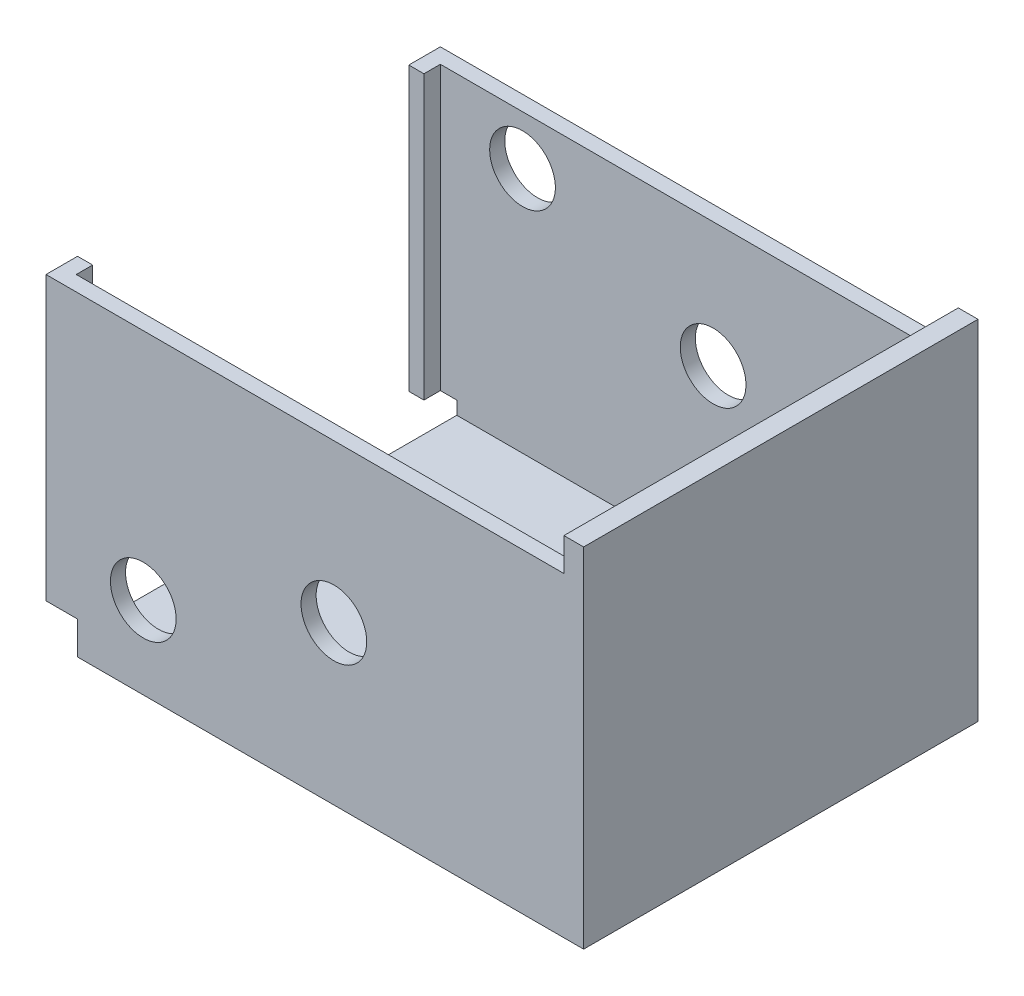
ISO-10303-21;
HEADER;
FILE_DESCRIPTION(('STEP AP214'),'2;1');
FILE_NAME('part.step','',(''),(''),'','','');
FILE_SCHEMA(('AUTOMOTIVE_DESIGN { 1 0 10303 214 1 1 1 1 }'));
ENDSEC;
DATA;
#1=APPLICATION_CONTEXT('core data for automotive mechanical design processes');
#2=APPLICATION_PROTOCOL_DEFINITION('international standard','automotive_design',2000,#1);
#3=PRODUCT_CONTEXT('',#1,'mechanical');
#4=PRODUCT('Part','Part','',(#3));
#5=PRODUCT_RELATED_PRODUCT_CATEGORY('part','',(#4));
#6=PRODUCT_DEFINITION_FORMATION('','',#4);
#7=PRODUCT_DEFINITION_CONTEXT('part definition',#1,'design');
#8=PRODUCT_DEFINITION('design','',#6,#7);
#9=PRODUCT_DEFINITION_SHAPE('','',#8);
#10=(LENGTH_UNIT() NAMED_UNIT(*) SI_UNIT(.MILLI.,.METRE.));
#11=(NAMED_UNIT(*) PLANE_ANGLE_UNIT() SI_UNIT($,.RADIAN.));
#12=(NAMED_UNIT(*) SI_UNIT($,.STERADIAN.) SOLID_ANGLE_UNIT());
#13=UNCERTAINTY_MEASURE_WITH_UNIT(LENGTH_MEASURE(1.E-05),#10,'distance_accuracy_value','');
#14=(GEOMETRIC_REPRESENTATION_CONTEXT(3) GLOBAL_UNCERTAINTY_ASSIGNED_CONTEXT((#13)) GLOBAL_UNIT_ASSIGNED_CONTEXT((#10,
#11,#12)) REPRESENTATION_CONTEXT('',''));
#15=CARTESIAN_POINT('',(0.,0.,0.));
#16=DIRECTION('',(0.,0.,1.));
#17=DIRECTION('',(1.,0.,0.));
#18=AXIS2_PLACEMENT_3D('',#15,#16,#17);
#19=CARTESIAN_POINT('',(74.,53.,-57.7));
#20=DIRECTION('',(0.,0.,-1.));
#21=DIRECTION('',(-1.,0.,0.));
#22=AXIS2_PLACEMENT_3D('',#19,#20,#21);
#23=PLANE('',#22);
#24=CARTESIAN_POINT('',(9.99999999999999,40.5,-57.7));
#25=DIRECTION('',(0.,0.,-1.));
#26=DIRECTION('',(-1.,0.,0.));
#27=AXIS2_PLACEMENT_3D('',#24,#25,#26);
#28=CIRCLE('',#27,5.);
#29=CARTESIAN_POINT('',(4.99999999999999,40.5,-57.7));
#30=VERTEX_POINT('',#29);
#31=EDGE_CURVE('E290',#30,#30,#28,.F.);
#32=ORIENTED_EDGE('',*,*,#31,.F.);
#33=EDGE_LOOP('',(#32));
#34=FACE_BOUND('',#33,.T.);
#35=CARTESIAN_POINT('',(39.,29.,-57.7));
#36=DIRECTION('',(0.,0.,-1.));
#37=DIRECTION('',(-1.,0.,0.));
#38=AXIS2_PLACEMENT_3D('',#35,#36,#37);
#39=CIRCLE('',#38,5.);
#40=CARTESIAN_POINT('',(34.,29.,-57.7));
#41=VERTEX_POINT('',#40);
#42=EDGE_CURVE('E283',#41,#41,#39,.F.);
#43=ORIENTED_EDGE('',*,*,#42,.F.);
#44=EDGE_LOOP('',(#43));
#45=FACE_BOUND('',#44,.T.);
#46=DIRECTION('',(0.,-1.,0.));
#47=VECTOR('',#46,1.);
#48=CARTESIAN_POINT('',(74.,53.,-57.7));
#49=LINE('',#48,#47);
#50=CARTESIAN_POINT('',(74.,48.,-57.7));
#51=VERTEX_POINT('',#50);
#52=CARTESIAN_POINT('',(74.,3.,-57.7));
#53=VERTEX_POINT('',#52);
#54=EDGE_CURVE('E310',#51,#53,#49,.T.);
#55=ORIENTED_EDGE('',*,*,#54,.F.);
#56=DIRECTION('',(1.,0.,0.));
#57=VECTOR('',#56,1.);
#58=CARTESIAN_POINT('',(-2.49999999999999,48.,-57.7));
#59=LINE('',#58,#57);
#60=CARTESIAN_POINT('',(-2.49999999999999,48.,-57.7));
#61=VERTEX_POINT('',#60);
#62=EDGE_CURVE('E252',#61,#51,#59,.T.);
#63=ORIENTED_EDGE('',*,*,#62,.F.);
#64=DIRECTION('',(0.,-1.,0.));
#65=VECTOR('',#64,1.);
#66=CARTESIAN_POINT('',(-2.49999999999999,59.7882250993909,-57.7));
#67=LINE('',#66,#65);
#68=CARTESIAN_POINT('',(-2.49999999999999,5.,-57.7));
#69=VERTEX_POINT('',#68);
#70=EDGE_CURVE('E227',#61,#69,#67,.T.);
#71=ORIENTED_EDGE('',*,*,#70,.T.);
#72=DIRECTION('',(-1.,0.,0.));
#73=VECTOR('',#72,1.);
#74=CARTESIAN_POINT('',(0.,5.,-57.7));
#75=LINE('',#74,#73);
#76=CARTESIAN_POINT('',(0.,5.,-57.7));
#77=VERTEX_POINT('',#76);
#78=EDGE_CURVE('E61',#77,#69,#75,.T.);
#79=ORIENTED_EDGE('',*,*,#78,.F.);
#80=DIRECTION('',(0.,-1.,0.));
#81=VECTOR('',#80,1.);
#82=CARTESIAN_POINT('',(0.,5.,-57.7));
#83=LINE('',#82,#81);
#84=CARTESIAN_POINT('',(0.,3.,-57.7));
#85=VERTEX_POINT('',#84);
#86=EDGE_CURVE('E213',#77,#85,#83,.T.);
#87=ORIENTED_EDGE('',*,*,#86,.T.);
#88=DIRECTION('',(1.,0.,0.));
#89=VECTOR('',#88,1.);
#90=CARTESIAN_POINT('',(74.,3.,-57.7));
#91=LINE('',#90,#89);
#92=EDGE_CURVE('E286',#85,#53,#91,.T.);
#93=ORIENTED_EDGE('',*,*,#92,.T.);
#94=EDGE_LOOP('',(#55,#63,#71,#79,#87,#93));
#95=FACE_BOUND('',#94,.T.);
#96=ADVANCED_FACE('F38',(#34,#45,#95),#23,.F.);
#97=CARTESIAN_POINT('',(0.,53.,-2.3));
#98=DIRECTION('',(0.,0.,1.));
#99=DIRECTION('',(1.,0.,0.));
#100=AXIS2_PLACEMENT_3D('',#97,#98,#99);
#101=PLANE('',#100);
#102=CARTESIAN_POINT('',(39.,24.,-2.3));
#103=DIRECTION('',(0.,0.,1.));
#104=DIRECTION('',(1.,0.,0.));
#105=AXIS2_PLACEMENT_3D('',#102,#103,#104);
#106=CIRCLE('',#105,5.);
#107=CARTESIAN_POINT('',(44.,24.,-2.3));
#108=VERTEX_POINT('',#107);
#109=EDGE_CURVE('E202',#108,#108,#106,.T.);
#110=ORIENTED_EDGE('',*,*,#109,.T.);
#111=EDGE_LOOP('',(#110));
#112=FACE_BOUND('',#111,.T.);
#113=CARTESIAN_POINT('',(9.99999999999999,12.5,-2.3));
#114=DIRECTION('',(0.,0.,1.));
#115=DIRECTION('',(1.,0.,0.));
#116=AXIS2_PLACEMENT_3D('',#113,#114,#115);
#117=CIRCLE('',#116,5.);
#118=CARTESIAN_POINT('',(15.,12.5,-2.3));
#119=VERTEX_POINT('',#118);
#120=EDGE_CURVE('E207',#119,#119,#117,.T.);
#121=ORIENTED_EDGE('',*,*,#120,.T.);
#122=EDGE_LOOP('',(#121));
#123=FACE_BOUND('',#122,.T.);
#124=DIRECTION('',(-1.,0.,0.));
#125=VECTOR('',#124,1.);
#126=CARTESIAN_POINT('',(-2.5,48.,-2.3));
#127=LINE('',#126,#125);
#128=CARTESIAN_POINT('',(74.,48.,-2.3));
#129=VERTEX_POINT('',#128);
#130=CARTESIAN_POINT('',(-2.5,48.,-2.3));
#131=VERTEX_POINT('',#130);
#132=EDGE_CURVE('E177',#129,#131,#127,.T.);
#133=ORIENTED_EDGE('',*,*,#132,.F.);
#134=DIRECTION('',(0.,-1.,0.));
#135=VECTOR('',#134,1.);
#136=CARTESIAN_POINT('',(74.,53.,-2.3));
#137=LINE('',#136,#135);
#138=CARTESIAN_POINT('',(74.,3.,-2.3));
#139=VERTEX_POINT('',#138);
#140=EDGE_CURVE('E185',#129,#139,#137,.T.);
#141=ORIENTED_EDGE('',*,*,#140,.T.);
#142=DIRECTION('',(-1.,0.,0.));
#143=VECTOR('',#142,1.);
#144=CARTESIAN_POINT('',(0.,3.,-2.3));
#145=LINE('',#144,#143);
#146=CARTESIAN_POINT('',(0.,3.,-2.3));
#147=VERTEX_POINT('',#146);
#148=EDGE_CURVE('E297',#139,#147,#145,.T.);
#149=ORIENTED_EDGE('',*,*,#148,.T.);
#150=DIRECTION('',(0.,-1.,0.));
#151=VECTOR('',#150,1.);
#152=CARTESIAN_POINT('',(0.,5.,-2.3));
#153=LINE('',#152,#151);
#154=CARTESIAN_POINT('',(0.,5.,-2.3));
#155=VERTEX_POINT('',#154);
#156=EDGE_CURVE('E225',#155,#147,#153,.T.);
#157=ORIENTED_EDGE('',*,*,#156,.F.);
#158=DIRECTION('',(1.,0.,0.));
#159=VECTOR('',#158,1.);
#160=CARTESIAN_POINT('',(0.,5.,-2.3));
#161=LINE('',#160,#159);
#162=CARTESIAN_POINT('',(-2.5,5.,-2.3));
#163=VERTEX_POINT('',#162);
#164=EDGE_CURVE('E221',#163,#155,#161,.T.);
#165=ORIENTED_EDGE('',*,*,#164,.F.);
#166=DIRECTION('',(0.,-1.,0.));
#167=VECTOR('',#166,1.);
#168=CARTESIAN_POINT('',(-2.5,59.7882250993909,-2.3));
#169=LINE('',#168,#167);
#170=EDGE_CURVE('E269',#131,#163,#169,.T.);
#171=ORIENTED_EDGE('',*,*,#170,.F.);
#172=EDGE_LOOP('',(#133,#141,#149,#157,#165,#171));
#173=FACE_BOUND('',#172,.T.);
#174=ADVANCED_FACE('F367',(#112,#123,#173),#101,.F.);
#175=CARTESIAN_POINT('',(-4.79999999999999,59.7882250993909,-60.));
#176=DIRECTION('',(-1.,0.,0.));
#177=DIRECTION('',(0.,0.,1.));
#178=AXIS2_PLACEMENT_3D('',#175,#176,#177);
#179=PLANE('',#178);
#180=DIRECTION('',(0.,-1.,0.));
#181=VECTOR('',#180,1.);
#182=CARTESIAN_POINT('',(-4.79999999999999,59.7882250993909,-60.));
#183=LINE('',#182,#181);
#184=CARTESIAN_POINT('',(-4.79999999999999,48.,-60.));
#185=VERTEX_POINT('',#184);
#186=CARTESIAN_POINT('',(-4.8,5.,-60.));
#187=VERTEX_POINT('',#186);
#188=EDGE_CURVE('E248',#185,#187,#183,.T.);
#189=ORIENTED_EDGE('',*,*,#188,.T.);
#190=DIRECTION('',(0.,0.,-1.));
#191=VECTOR('',#190,1.);
#192=CARTESIAN_POINT('',(-4.8,5.,-55.2));
#193=LINE('',#192,#191);
#194=CARTESIAN_POINT('',(-4.8,5.,-55.2));
#195=VERTEX_POINT('',#194);
#196=EDGE_CURVE('E239',#195,#187,#193,.T.);
#197=ORIENTED_EDGE('',*,*,#196,.F.);
#198=DIRECTION('',(0.,-1.,0.));
#199=VECTOR('',#198,1.);
#200=CARTESIAN_POINT('',(-4.79999999999999,59.7882250993909,-55.2));
#201=LINE('',#200,#199);
#202=CARTESIAN_POINT('',(-4.79999999999999,48.,-55.2));
#203=VERTEX_POINT('',#202);
#204=EDGE_CURVE('E257',#203,#195,#201,.T.);
#205=ORIENTED_EDGE('',*,*,#204,.F.);
#206=DIRECTION('',(0.,0.,1.));
#207=VECTOR('',#206,1.);
#208=CARTESIAN_POINT('',(-4.79999999999999,48.,-60.));
#209=LINE('',#208,#207);
#210=EDGE_CURVE('E247',#185,#203,#209,.T.);
#211=ORIENTED_EDGE('',*,*,#210,.F.);
#212=EDGE_LOOP('',(#189,#197,#205,#211));
#213=FACE_BOUND('',#212,.T.);
#214=ADVANCED_FACE('F342',(#213),#179,.T.);
#215=CARTESIAN_POINT('',(-4.79999999999999,59.7882250993909,-55.2));
#216=DIRECTION('',(0.,0.,1.));
#217=DIRECTION('',(1.,0.,0.));
#218=AXIS2_PLACEMENT_3D('',#215,#216,#217);
#219=PLANE('',#218);
#220=ORIENTED_EDGE('',*,*,#204,.T.);
#221=DIRECTION('',(-1.,0.,0.));
#222=VECTOR('',#221,1.);
#223=CARTESIAN_POINT('',(-2.5,5.,-55.2));
#224=LINE('',#223,#222);
#225=CARTESIAN_POINT('',(-2.5,5.,-55.2));
#226=VERTEX_POINT('',#225);
#227=EDGE_CURVE('E237',#226,#195,#224,.T.);
#228=ORIENTED_EDGE('',*,*,#227,.F.);
#229=DIRECTION('',(0.,-1.,0.));
#230=VECTOR('',#229,1.);
#231=CARTESIAN_POINT('',(-2.49999999999999,59.7882250993909,-55.2));
#232=LINE('',#231,#230);
#233=CARTESIAN_POINT('',(-2.49999999999999,48.,-55.2));
#234=VERTEX_POINT('',#233);
#235=EDGE_CURVE('E260',#234,#226,#232,.T.);
#236=ORIENTED_EDGE('',*,*,#235,.F.);
#237=DIRECTION('',(1.,0.,0.));
#238=VECTOR('',#237,1.);
#239=CARTESIAN_POINT('',(-4.79999999999999,48.,-55.2));
#240=LINE('',#239,#238);
#241=EDGE_CURVE('E245',#203,#234,#240,.T.);
#242=ORIENTED_EDGE('',*,*,#241,.F.);
#243=EDGE_LOOP('',(#220,#228,#236,#242));
#244=FACE_BOUND('',#243,.T.);
#245=ADVANCED_FACE('F350',(#244),#219,.T.);
#246=CARTESIAN_POINT('',(-2.49999999999999,59.7882250993909,-55.2));
#247=DIRECTION('',(1.,0.,0.));
#248=DIRECTION('',(0.,0.,-1.));
#249=AXIS2_PLACEMENT_3D('',#246,#247,#248);
#250=PLANE('',#249);
#251=ORIENTED_EDGE('',*,*,#235,.T.);
#252=DIRECTION('',(0.,0.,1.));
#253=VECTOR('',#252,1.);
#254=CARTESIAN_POINT('',(-2.5,5.,-57.7));
#255=LINE('',#254,#253);
#256=EDGE_CURVE('E235',#69,#226,#255,.T.);
#257=ORIENTED_EDGE('',*,*,#256,.F.);
#258=ORIENTED_EDGE('',*,*,#70,.F.);
#259=DIRECTION('',(0.,0.,-1.));
#260=VECTOR('',#259,1.);
#261=CARTESIAN_POINT('',(-2.49999999999999,48.,-55.2));
#262=LINE('',#261,#260);
#263=EDGE_CURVE('E254',#234,#61,#262,.T.);
#264=ORIENTED_EDGE('',*,*,#263,.F.);
#265=EDGE_LOOP('',(#251,#257,#258,#264));
#266=FACE_BOUND('',#265,.T.);
#267=ADVANCED_FACE('F355',(#266),#250,.T.);
#268=CARTESIAN_POINT('',(0.,3.,0.));
#269=DIRECTION('',(1.,0.,0.));
#270=DIRECTION('',(0.,0.,-1.));
#271=AXIS2_PLACEMENT_3D('',#268,#269,#270);
#272=PLANE('',#271);
#273=DIRECTION('',(0.,0.,1.));
#274=VECTOR('',#273,1.);
#275=CARTESIAN_POINT('',(0.,3.,0.));
#276=LINE('',#275,#274);
#277=EDGE_CURVE('E313',#85,#147,#276,.T.);
#278=ORIENTED_EDGE('',*,*,#277,.F.);
#279=ORIENTED_EDGE('',*,*,#86,.F.);
#280=DIRECTION('',(0.,0.,1.));
#281=VECTOR('',#280,1.);
#282=CARTESIAN_POINT('',(0.,5.,-60.));
#283=LINE('',#282,#281);
#284=CARTESIAN_POINT('',(0.,5.,-60.));
#285=VERTEX_POINT('',#284);
#286=EDGE_CURVE('E232',#285,#77,#283,.T.);
#287=ORIENTED_EDGE('',*,*,#286,.F.);
#288=DIRECTION('',(0.,-1.,0.));
#289=VECTOR('',#288,1.);
#290=CARTESIAN_POINT('',(0.,5.,-60.));
#291=LINE('',#290,#289);
#292=CARTESIAN_POINT('',(0.,0.,-60.));
#293=VERTEX_POINT('',#292);
#294=EDGE_CURVE('E241',#285,#293,#291,.T.);
#295=ORIENTED_EDGE('',*,*,#294,.T.);
#296=DIRECTION('',(0.,0.,1.));
#297=VECTOR('',#296,1.);
#298=CARTESIAN_POINT('',(0.,0.,0.));
#299=LINE('',#298,#297);
#300=CARTESIAN_POINT('',(0.,0.,0.));
#301=VERTEX_POINT('',#300);
#302=EDGE_CURVE('E312',#293,#301,#299,.T.);
#303=ORIENTED_EDGE('',*,*,#302,.T.);
#304=DIRECTION('',(0.,-1.,0.));
#305=VECTOR('',#304,1.);
#306=CARTESIAN_POINT('',(0.,5.,0.));
#307=LINE('',#306,#305);
#308=CARTESIAN_POINT('',(0.,5.,0.));
#309=VERTEX_POINT('',#308);
#310=EDGE_CURVE('E224',#309,#301,#307,.T.);
#311=ORIENTED_EDGE('',*,*,#310,.F.);
#312=DIRECTION('',(0.,0.,1.));
#313=VECTOR('',#312,1.);
#314=CARTESIAN_POINT('',(0.,5.,0.));
#315=LINE('',#314,#313);
#316=EDGE_CURVE('E211',#155,#309,#315,.T.);
#317=ORIENTED_EDGE('',*,*,#316,.F.);
#318=ORIENTED_EDGE('',*,*,#156,.T.);
#319=EDGE_LOOP('',(#278,#279,#287,#295,#303,#311,#317,#318));
#320=FACE_BOUND('',#319,.T.);
#321=ADVANCED_FACE('F40',(#320),#272,.F.);
#322=CARTESIAN_POINT('',(74.,53.,-2.3));
#323=DIRECTION('',(1.,0.,0.));
#324=DIRECTION('',(0.,0.,-1.));
#325=AXIS2_PLACEMENT_3D('',#322,#323,#324);
#326=PLANE('',#325);
#327=DIRECTION('',(0.,0.,-1.));
#328=VECTOR('',#327,1.);
#329=CARTESIAN_POINT('',(74.,48.,-60.));
#330=LINE('',#329,#328);
#331=CARTESIAN_POINT('',(74.,48.,-60.));
#332=VERTEX_POINT('',#331);
#333=EDGE_CURVE('E186',#51,#332,#330,.T.);
#334=ORIENTED_EDGE('',*,*,#333,.F.);
#335=ORIENTED_EDGE('',*,*,#54,.T.);
#336=DIRECTION('',(0.,0.,1.));
#337=VECTOR('',#336,1.);
#338=CARTESIAN_POINT('',(74.,3.,-2.3));
#339=LINE('',#338,#337);
#340=EDGE_CURVE('E305',#53,#139,#339,.T.);
#341=ORIENTED_EDGE('',*,*,#340,.T.);
#342=ORIENTED_EDGE('',*,*,#140,.F.);
#343=CARTESIAN_POINT('',(74.,48.,0.));
#344=VERTEX_POINT('',#343);
#345=EDGE_CURVE('E168',#344,#129,#330,.T.);
#346=ORIENTED_EDGE('',*,*,#345,.F.);
#347=DIRECTION('',(0.,1.,0.));
#348=VECTOR('',#347,1.);
#349=CARTESIAN_POINT('',(74.,48.,0.));
#350=LINE('',#349,#348);
#351=CARTESIAN_POINT('',(74.,53.,0.));
#352=VERTEX_POINT('',#351);
#353=EDGE_CURVE('E182',#344,#352,#350,.T.);
#354=ORIENTED_EDGE('',*,*,#353,.T.);
#355=DIRECTION('',(0.,0.,-1.));
#356=VECTOR('',#355,1.);
#357=CARTESIAN_POINT('',(74.,53.,-60.));
#358=LINE('',#357,#356);
#359=CARTESIAN_POINT('',(74.,53.,-60.));
#360=VERTEX_POINT('',#359);
#361=EDGE_CURVE('E653',#352,#360,#358,.T.);
#362=ORIENTED_EDGE('',*,*,#361,.T.);
#363=DIRECTION('',(0.,1.,0.));
#364=VECTOR('',#363,1.);
#365=CARTESIAN_POINT('',(74.,48.,-60.));
#366=LINE('',#365,#364);
#367=EDGE_CURVE('E192',#332,#360,#366,.T.);
#368=ORIENTED_EDGE('',*,*,#367,.F.);
#369=EDGE_LOOP('',(#334,#335,#341,#342,#346,#354,#362,#368));
#370=FACE_BOUND('',#369,.T.);
#371=ADVANCED_FACE('F181',(#370),#326,.F.);
#372=CARTESIAN_POINT('',(0.,3.,0.));
#373=DIRECTION('',(0.,-1.,0.));
#374=DIRECTION('',(0.,0.,-1.));
#375=AXIS2_PLACEMENT_3D('',#372,#373,#374);
#376=PLANE('',#375);
#377=ORIENTED_EDGE('',*,*,#148,.F.);
#378=ORIENTED_EDGE('',*,*,#340,.F.);
#379=ORIENTED_EDGE('',*,*,#92,.F.);
#380=ORIENTED_EDGE('',*,*,#277,.T.);
#381=EDGE_LOOP('',(#377,#378,#379,#380));
#382=FACE_BOUND('',#381,.T.);
#383=ADVANCED_FACE('F364',(#382),#376,.F.);
#384=CARTESIAN_POINT('',(0.,3.,0.));
#385=DIRECTION('',(0.,0.,-1.));
#386=DIRECTION('',(-1.,0.,0.));
#387=AXIS2_PLACEMENT_3D('',#384,#385,#386);
#388=PLANE('',#387);
#389=CARTESIAN_POINT('',(9.99999999999999,12.5,0.));
#390=DIRECTION('',(0.,0.,1.));
#391=DIRECTION('',(1.,0.,0.));
#392=AXIS2_PLACEMENT_3D('',#389,#390,#391);
#393=CIRCLE('',#392,5.);
#394=CARTESIAN_POINT('',(15.,12.5,0.));
#395=VERTEX_POINT('',#394);
#396=EDGE_CURVE('E199',#395,#395,#393,.T.);
#397=ORIENTED_EDGE('',*,*,#396,.F.);
#398=EDGE_LOOP('',(#397));
#399=FACE_BOUND('',#398,.T.);
#400=CARTESIAN_POINT('',(39.,24.,0.));
#401=DIRECTION('',(0.,0.,1.));
#402=DIRECTION('',(1.,0.,0.));
#403=AXIS2_PLACEMENT_3D('',#400,#401,#402);
#404=CIRCLE('',#403,5.);
#405=CARTESIAN_POINT('',(44.,24.,0.));
#406=VERTEX_POINT('',#405);
#407=EDGE_CURVE('E195',#406,#406,#404,.T.);
#408=ORIENTED_EDGE('',*,*,#407,.F.);
#409=EDGE_LOOP('',(#408));
#410=FACE_BOUND('',#409,.T.);
#411=DIRECTION('',(1.,0.,0.));
#412=VECTOR('',#411,1.);
#413=CARTESIAN_POINT('',(77.,53.,0.));
#414=LINE('',#413,#412);
#415=CARTESIAN_POINT('',(77.,53.,0.));
#416=VERTEX_POINT('',#415);
#417=EDGE_CURVE('E191',#352,#416,#414,.T.);
#418=ORIENTED_EDGE('',*,*,#417,.F.);
#419=ORIENTED_EDGE('',*,*,#353,.F.);
#420=DIRECTION('',(1.,0.,0.));
#421=VECTOR('',#420,1.);
#422=CARTESIAN_POINT('',(0.,48.,0.));
#423=LINE('',#422,#421);
#424=CARTESIAN_POINT('',(-4.8,48.,0.));
#425=VERTEX_POINT('',#424);
#426=EDGE_CURVE('E165',#425,#344,#423,.T.);
#427=ORIENTED_EDGE('',*,*,#426,.F.);
#428=DIRECTION('',(0.,-1.,0.));
#429=VECTOR('',#428,1.);
#430=CARTESIAN_POINT('',(-4.8,59.7882250993909,0.));
#431=LINE('',#430,#429);
#432=CARTESIAN_POINT('',(-4.8,5.,0.));
#433=VERTEX_POINT('',#432);
#434=EDGE_CURVE('E266',#425,#433,#431,.T.);
#435=ORIENTED_EDGE('',*,*,#434,.T.);
#436=DIRECTION('',(-1.,0.,0.));
#437=VECTOR('',#436,1.);
#438=CARTESIAN_POINT('',(-4.8,5.,0.));
#439=LINE('',#438,#437);
#440=EDGE_CURVE('E53',#309,#433,#439,.T.);
#441=ORIENTED_EDGE('',*,*,#440,.F.);
#442=ORIENTED_EDGE('',*,*,#310,.T.);
#443=DIRECTION('',(1.,0.,0.));
#444=VECTOR('',#443,1.);
#445=CARTESIAN_POINT('',(0.,0.,0.));
#446=LINE('',#445,#444);
#447=CARTESIAN_POINT('',(77.,0.,0.));
#448=VERTEX_POINT('',#447);
#449=EDGE_CURVE('E318',#301,#448,#446,.T.);
#450=ORIENTED_EDGE('',*,*,#449,.T.);
#451=DIRECTION('',(0.,-1.,0.));
#452=VECTOR('',#451,1.);
#453=CARTESIAN_POINT('',(77.,3.,0.));
#454=LINE('',#453,#452);
#455=EDGE_CURVE('E12',#416,#448,#454,.T.);
#456=ORIENTED_EDGE('',*,*,#455,.F.);
#457=EDGE_LOOP('',(#418,#419,#427,#435,#441,#442,#450,#456));
#458=FACE_BOUND('',#457,.T.);
#459=ADVANCED_FACE('F189',(#399,#410,#458),#388,.F.);
#460=CARTESIAN_POINT('',(77.,3.,0.));
#461=DIRECTION('',(-1.,0.,0.));
#462=DIRECTION('',(0.,0.,1.));
#463=AXIS2_PLACEMENT_3D('',#460,#461,#462);
#464=PLANE('',#463);
#465=DIRECTION('',(0.,0.,-1.));
#466=VECTOR('',#465,1.);
#467=CARTESIAN_POINT('',(77.,0.,0.));
#468=LINE('',#467,#466);
#469=CARTESIAN_POINT('',(77.,0.,-60.));
#470=VERTEX_POINT('',#469);
#471=EDGE_CURVE('E320',#448,#470,#468,.T.);
#472=ORIENTED_EDGE('',*,*,#471,.T.);
#473=DIRECTION('',(0.,-1.,0.));
#474=VECTOR('',#473,1.);
#475=CARTESIAN_POINT('',(77.,3.,-60.));
#476=LINE('',#475,#474);
#477=CARTESIAN_POINT('',(77.,53.,-60.));
#478=VERTEX_POINT('',#477);
#479=EDGE_CURVE('E46',#478,#470,#476,.T.);
#480=ORIENTED_EDGE('',*,*,#479,.F.);
#481=DIRECTION('',(0.,0.,-1.));
#482=VECTOR('',#481,1.);
#483=CARTESIAN_POINT('',(77.,53.,-60.));
#484=LINE('',#483,#482);
#485=EDGE_CURVE('E296',#416,#478,#484,.T.);
#486=ORIENTED_EDGE('',*,*,#485,.F.);
#487=ORIENTED_EDGE('',*,*,#455,.T.);
#488=EDGE_LOOP('',(#472,#480,#486,#487));
#489=FACE_BOUND('',#488,.T.);
#490=ADVANCED_FACE('F414',(#489),#464,.F.);
#491=CARTESIAN_POINT('',(0.,3.,-60.));
#492=DIRECTION('',(0.,0.,1.));
#493=DIRECTION('',(1.,0.,0.));
#494=AXIS2_PLACEMENT_3D('',#491,#492,#493);
#495=PLANE('',#494);
#496=CARTESIAN_POINT('',(39.,29.,-60.));
#497=DIRECTION('',(0.,0.,-1.));
#498=DIRECTION('',(-1.,0.,0.));
#499=AXIS2_PLACEMENT_3D('',#496,#497,#498);
#500=CIRCLE('',#499,5.);
#501=CARTESIAN_POINT('',(34.,29.,-60.));
#502=VERTEX_POINT('',#501);
#503=EDGE_CURVE('E287',#502,#502,#500,.T.);
#504=ORIENTED_EDGE('',*,*,#503,.F.);
#505=EDGE_LOOP('',(#504));
#506=FACE_BOUND('',#505,.T.);
#507=CARTESIAN_POINT('',(9.99999999999999,40.5,-60.));
#508=DIRECTION('',(0.,0.,-1.));
#509=DIRECTION('',(-1.,0.,0.));
#510=AXIS2_PLACEMENT_3D('',#507,#508,#509);
#511=CIRCLE('',#510,5.);
#512=CARTESIAN_POINT('',(4.99999999999999,40.5,-60.));
#513=VERTEX_POINT('',#512);
#514=EDGE_CURVE('E176',#513,#513,#511,.T.);
#515=ORIENTED_EDGE('',*,*,#514,.F.);
#516=EDGE_LOOP('',(#515));
#517=FACE_BOUND('',#516,.T.);
#518=DIRECTION('',(-1.,0.,0.));
#519=VECTOR('',#518,1.);
#520=CARTESIAN_POINT('',(0.,48.,-60.));
#521=LINE('',#520,#519);
#522=EDGE_CURVE('E250',#332,#185,#521,.T.);
#523=ORIENTED_EDGE('',*,*,#522,.F.);
#524=ORIENTED_EDGE('',*,*,#367,.T.);
#525=DIRECTION('',(-1.,0.,0.));
#526=VECTOR('',#525,1.);
#527=CARTESIAN_POINT('',(0.,53.,-60.));
#528=LINE('',#527,#526);
#529=EDGE_CURVE('E300',#478,#360,#528,.T.);
#530=ORIENTED_EDGE('',*,*,#529,.F.);
#531=ORIENTED_EDGE('',*,*,#479,.T.);
#532=DIRECTION('',(-1.,0.,0.));
#533=VECTOR('',#532,1.);
#534=CARTESIAN_POINT('',(0.,0.,-60.));
#535=LINE('',#534,#533);
#536=EDGE_CURVE('E316',#470,#293,#535,.T.);
#537=ORIENTED_EDGE('',*,*,#536,.T.);
#538=ORIENTED_EDGE('',*,*,#294,.F.);
#539=DIRECTION('',(1.,0.,0.));
#540=VECTOR('',#539,1.);
#541=CARTESIAN_POINT('',(-4.8,5.,-60.));
#542=LINE('',#541,#540);
#543=EDGE_CURVE('E210',#187,#285,#542,.T.);
#544=ORIENTED_EDGE('',*,*,#543,.F.);
#545=ORIENTED_EDGE('',*,*,#188,.F.);
#546=EDGE_LOOP('',(#523,#524,#530,#531,#537,#538,#544,#545));
#547=FACE_BOUND('',#546,.T.);
#548=ADVANCED_FACE('F327',(#506,#517,#547),#495,.F.);
#549=CARTESIAN_POINT('',(0.,0.,0.));
#550=DIRECTION('',(0.,-1.,0.));
#551=DIRECTION('',(0.,0.,-1.));
#552=AXIS2_PLACEMENT_3D('',#549,#550,#551);
#553=PLANE('',#552);
#554=ORIENTED_EDGE('',*,*,#449,.F.);
#555=ORIENTED_EDGE('',*,*,#302,.F.);
#556=ORIENTED_EDGE('',*,*,#536,.F.);
#557=ORIENTED_EDGE('',*,*,#471,.F.);
#558=EDGE_LOOP('',(#554,#555,#556,#557));
#559=FACE_BOUND('',#558,.T.);
#560=ADVANCED_FACE('F334',(#559),#553,.T.);
#561=CARTESIAN_POINT('',(0.,53.,0.));
#562=DIRECTION('',(0.,-1.,0.));
#563=DIRECTION('',(0.,0.,-1.));
#564=AXIS2_PLACEMENT_3D('',#561,#562,#563);
#565=PLANE('',#564);
#566=ORIENTED_EDGE('',*,*,#529,.T.);
#567=ORIENTED_EDGE('',*,*,#361,.F.);
#568=ORIENTED_EDGE('',*,*,#417,.T.);
#569=ORIENTED_EDGE('',*,*,#485,.T.);
#570=EDGE_LOOP('',(#566,#567,#568,#569));
#571=FACE_BOUND('',#570,.T.);
#572=ADVANCED_FACE('F411',(#571),#565,.F.);
#573=CARTESIAN_POINT('',(9.99999999999999,40.5,0.001000000000001));
#574=DIRECTION('',(0.,0.,-1.));
#575=DIRECTION('',(-1.,0.,0.));
#576=AXIS2_PLACEMENT_3D('',#573,#574,#575);
#577=CYLINDRICAL_SURFACE('',#576,5.);
#578=ORIENTED_EDGE('',*,*,#514,.T.);
#579=EDGE_LOOP('',(#578));
#580=FACE_BOUND('',#579,.T.);
#581=ORIENTED_EDGE('',*,*,#31,.T.);
#582=EDGE_LOOP('',(#581));
#583=FACE_BOUND('',#582,.T.);
#584=ADVANCED_FACE('F535',(#580,#583),#577,.F.);
#585=CARTESIAN_POINT('',(39.,29.,0.001000000000001));
#586=DIRECTION('',(0.,0.,-1.));
#587=DIRECTION('',(-1.,0.,0.));
#588=AXIS2_PLACEMENT_3D('',#585,#586,#587);
#589=CYLINDRICAL_SURFACE('',#588,5.);
#590=ORIENTED_EDGE('',*,*,#503,.T.);
#591=EDGE_LOOP('',(#590));
#592=FACE_BOUND('',#591,.T.);
#593=ORIENTED_EDGE('',*,*,#42,.T.);
#594=EDGE_LOOP('',(#593));
#595=FACE_BOUND('',#594,.T.);
#596=ADVANCED_FACE('F477',(#592,#595),#589,.F.);
#597=CARTESIAN_POINT('',(-2.5,59.7882250993909,-4.8));
#598=DIRECTION('',(1.,0.,0.));
#599=DIRECTION('',(0.,0.,-1.));
#600=AXIS2_PLACEMENT_3D('',#597,#598,#599);
#601=PLANE('',#600);
#602=DIRECTION('',(0.,0.,1.));
#603=VECTOR('',#602,1.);
#604=CARTESIAN_POINT('',(-2.5,5.,-2.3));
#605=LINE('',#604,#603);
#606=CARTESIAN_POINT('',(-2.5,5.,-4.8));
#607=VERTEX_POINT('',#606);
#608=EDGE_CURVE('E219',#607,#163,#605,.T.);
#609=ORIENTED_EDGE('',*,*,#608,.F.);
#610=DIRECTION('',(0.,-1.,0.));
#611=VECTOR('',#610,1.);
#612=CARTESIAN_POINT('',(-2.5,59.7882250993909,-4.8));
#613=LINE('',#612,#611);
#614=CARTESIAN_POINT('',(-2.5,48.,-4.8));
#615=VERTEX_POINT('',#614);
#616=EDGE_CURVE('E276',#615,#607,#613,.T.);
#617=ORIENTED_EDGE('',*,*,#616,.F.);
#618=DIRECTION('',(0.,0.,-1.));
#619=VECTOR('',#618,1.);
#620=CARTESIAN_POINT('',(-2.5,48.,-4.8));
#621=LINE('',#620,#619);
#622=EDGE_CURVE('E271',#131,#615,#621,.T.);
#623=ORIENTED_EDGE('',*,*,#622,.F.);
#624=ORIENTED_EDGE('',*,*,#170,.T.);
#625=EDGE_LOOP('',(#609,#617,#623,#624));
#626=FACE_BOUND('',#625,.T.);
#627=ADVANCED_FACE('F375',(#626),#601,.T.);
#628=CARTESIAN_POINT('',(-4.8,59.7882250993909,-4.8));
#629=DIRECTION('',(0.,0.,-1.));
#630=DIRECTION('',(-1.,0.,0.));
#631=AXIS2_PLACEMENT_3D('',#628,#629,#630);
#632=PLANE('',#631);
#633=DIRECTION('',(1.,0.,0.));
#634=VECTOR('',#633,1.);
#635=CARTESIAN_POINT('',(-2.5,5.,-4.8));
#636=LINE('',#635,#634);
#637=CARTESIAN_POINT('',(-4.8,5.,-4.8));
#638=VERTEX_POINT('',#637);
#639=EDGE_CURVE('E217',#638,#607,#636,.T.);
#640=ORIENTED_EDGE('',*,*,#639,.F.);
#641=DIRECTION('',(0.,-1.,0.));
#642=VECTOR('',#641,1.);
#643=CARTESIAN_POINT('',(-4.8,59.7882250993909,-4.8));
#644=LINE('',#643,#642);
#645=CARTESIAN_POINT('',(-4.8,48.,-4.8));
#646=VERTEX_POINT('',#645);
#647=EDGE_CURVE('E279',#646,#638,#644,.T.);
#648=ORIENTED_EDGE('',*,*,#647,.F.);
#649=DIRECTION('',(-1.,0.,0.));
#650=VECTOR('',#649,1.);
#651=CARTESIAN_POINT('',(-4.8,48.,-4.8));
#652=LINE('',#651,#650);
#653=EDGE_CURVE('E268',#615,#646,#652,.T.);
#654=ORIENTED_EDGE('',*,*,#653,.F.);
#655=ORIENTED_EDGE('',*,*,#616,.T.);
#656=EDGE_LOOP('',(#640,#648,#654,#655));
#657=FACE_BOUND('',#656,.T.);
#658=ADVANCED_FACE('F378',(#657),#632,.T.);
#659=CARTESIAN_POINT('',(-4.8,59.7882250993909,0.));
#660=DIRECTION('',(-1.,0.,0.));
#661=DIRECTION('',(0.,0.,1.));
#662=AXIS2_PLACEMENT_3D('',#659,#660,#661);
#663=PLANE('',#662);
#664=DIRECTION('',(0.,0.,-1.));
#665=VECTOR('',#664,1.);
#666=CARTESIAN_POINT('',(-4.8,5.,-4.8));
#667=LINE('',#666,#665);
#668=EDGE_CURVE('E215',#433,#638,#667,.T.);
#669=ORIENTED_EDGE('',*,*,#668,.F.);
#670=ORIENTED_EDGE('',*,*,#434,.F.);
#671=DIRECTION('',(0.,0.,1.));
#672=VECTOR('',#671,1.);
#673=CARTESIAN_POINT('',(-4.8,48.,0.));
#674=LINE('',#673,#672);
#675=EDGE_CURVE('E171',#646,#425,#674,.T.);
#676=ORIENTED_EDGE('',*,*,#675,.F.);
#677=ORIENTED_EDGE('',*,*,#647,.T.);
#678=EDGE_LOOP('',(#669,#670,#676,#677));
#679=FACE_BOUND('',#678,.T.);
#680=ADVANCED_FACE('F381',(#679),#663,.T.);
#681=CARTESIAN_POINT('',(0.,48.,0.));
#682=DIRECTION('',(0.,-1.,0.));
#683=DIRECTION('',(0.,0.,-1.));
#684=AXIS2_PLACEMENT_3D('',#681,#682,#683);
#685=PLANE('',#684);
#686=ORIENTED_EDGE('',*,*,#426,.T.);
#687=ORIENTED_EDGE('',*,*,#345,.T.);
#688=ORIENTED_EDGE('',*,*,#132,.T.);
#689=ORIENTED_EDGE('',*,*,#622,.T.);
#690=ORIENTED_EDGE('',*,*,#653,.T.);
#691=ORIENTED_EDGE('',*,*,#675,.T.);
#692=EDGE_LOOP('',(#686,#687,#688,#689,#690,#691));
#693=FACE_BOUND('',#692,.T.);
#694=ADVANCED_FACE('F167',(#693),#685,.F.);
#695=CARTESIAN_POINT('',(0.,48.,0.));
#696=DIRECTION('',(0.,-1.,0.));
#697=DIRECTION('',(0.,0.,-1.));
#698=AXIS2_PLACEMENT_3D('',#695,#696,#697);
#699=PLANE('',#698);
#700=ORIENTED_EDGE('',*,*,#62,.T.);
#701=ORIENTED_EDGE('',*,*,#333,.T.);
#702=ORIENTED_EDGE('',*,*,#522,.T.);
#703=ORIENTED_EDGE('',*,*,#210,.T.);
#704=ORIENTED_EDGE('',*,*,#241,.T.);
#705=ORIENTED_EDGE('',*,*,#263,.T.);
#706=EDGE_LOOP('',(#700,#701,#702,#703,#704,#705));
#707=FACE_BOUND('',#706,.T.);
#708=ADVANCED_FACE('F346',(#707),#699,.F.);
#709=CARTESIAN_POINT('',(0.,5.,0.));
#710=DIRECTION('',(0.,-1.,0.));
#711=DIRECTION('',(0.,0.,-1.));
#712=AXIS2_PLACEMENT_3D('',#709,#710,#711);
#713=PLANE('',#712);
#714=ORIENTED_EDGE('',*,*,#543,.T.);
#715=ORIENTED_EDGE('',*,*,#286,.T.);
#716=ORIENTED_EDGE('',*,*,#78,.T.);
#717=ORIENTED_EDGE('',*,*,#256,.T.);
#718=ORIENTED_EDGE('',*,*,#227,.T.);
#719=ORIENTED_EDGE('',*,*,#196,.T.);
#720=EDGE_LOOP('',(#714,#715,#716,#717,#718,#719));
#721=FACE_BOUND('',#720,.T.);
#722=ADVANCED_FACE('F385',(#721),#713,.T.);
#723=CARTESIAN_POINT('',(0.,5.,0.));
#724=DIRECTION('',(0.,1.,0.));
#725=DIRECTION('',(0.,0.,1.));
#726=AXIS2_PLACEMENT_3D('',#723,#724,#725);
#727=PLANE('',#726);
#728=ORIENTED_EDGE('',*,*,#316,.T.);
#729=ORIENTED_EDGE('',*,*,#440,.T.);
#730=ORIENTED_EDGE('',*,*,#668,.T.);
#731=ORIENTED_EDGE('',*,*,#639,.T.);
#732=ORIENTED_EDGE('',*,*,#608,.T.);
#733=ORIENTED_EDGE('',*,*,#164,.T.);
#734=EDGE_LOOP('',(#728,#729,#730,#731,#732,#733));
#735=FACE_BOUND('',#734,.T.);
#736=ADVANCED_FACE('F382',(#735),#727,.F.);
#737=CARTESIAN_POINT('',(39.,24.,-3.));
#738=DIRECTION('',(0.,0.,1.));
#739=DIRECTION('',(1.,0.,0.));
#740=AXIS2_PLACEMENT_3D('',#737,#738,#739);
#741=CYLINDRICAL_SURFACE('',#740,5.);
#742=ORIENTED_EDGE('',*,*,#407,.T.);
#743=EDGE_LOOP('',(#742));
#744=FACE_BOUND('',#743,.T.);
#745=ORIENTED_EDGE('',*,*,#109,.F.);
#746=EDGE_LOOP('',(#745));
#747=FACE_BOUND('',#746,.T.);
#748=ADVANCED_FACE('F384',(#744,#747),#741,.F.);
#749=CARTESIAN_POINT('',(9.99999999999999,12.5,-3.));
#750=DIRECTION('',(0.,0.,1.));
#751=DIRECTION('',(1.,0.,0.));
#752=AXIS2_PLACEMENT_3D('',#749,#750,#751);
#753=CYLINDRICAL_SURFACE('',#752,5.);
#754=ORIENTED_EDGE('',*,*,#396,.T.);
#755=EDGE_LOOP('',(#754));
#756=FACE_BOUND('',#755,.T.);
#757=ORIENTED_EDGE('',*,*,#120,.F.);
#758=EDGE_LOOP('',(#757));
#759=FACE_BOUND('',#758,.T.);
#760=ADVANCED_FACE('F391',(#756,#759),#753,.F.);
#761=CLOSED_SHELL('',(#96,#174,#214,#245,#267,#321,#371,#383,#459,#490,#548,#560,#572,#584,#596,
#627,#658,#680,#694,#708,#722,#736,#748,#760));
#762=MANIFOLD_SOLID_BREP('B2',#761);
#763=ADVANCED_BREP_SHAPE_REPRESENTATION('',(#18,#762),#14);
#764=SHAPE_DEFINITION_REPRESENTATION(#9,#763);
ENDSEC;
END-ISO-10303-21;
